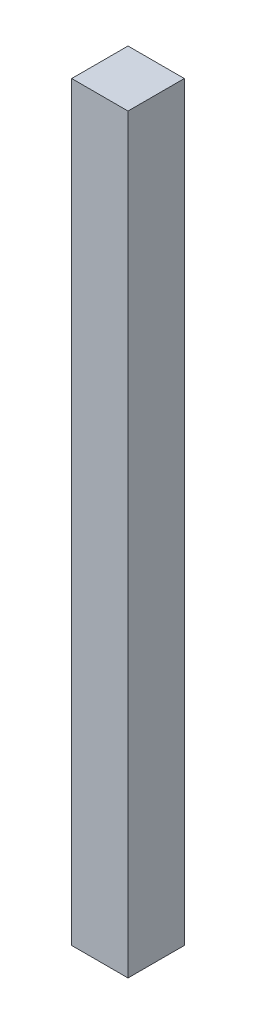
ISO-10303-21;
HEADER;
FILE_DESCRIPTION(('STEP AP214'),'2;1');
FILE_NAME('part.step','',(''),(''),'','','');
FILE_SCHEMA(('AUTOMOTIVE_DESIGN { 1 0 10303 214 1 1 1 1 }'));
ENDSEC;
DATA;
#1=APPLICATION_CONTEXT('core data for automotive mechanical design processes');
#2=APPLICATION_PROTOCOL_DEFINITION('international standard','automotive_design',2000,#1);
#3=PRODUCT_CONTEXT('',#1,'mechanical');
#4=PRODUCT('Part','Part','',(#3));
#5=PRODUCT_RELATED_PRODUCT_CATEGORY('part','',(#4));
#6=PRODUCT_DEFINITION_FORMATION('','',#4);
#7=PRODUCT_DEFINITION_CONTEXT('part definition',#1,'design');
#8=PRODUCT_DEFINITION('design','',#6,#7);
#9=PRODUCT_DEFINITION_SHAPE('','',#8);
#10=(LENGTH_UNIT() NAMED_UNIT(*) SI_UNIT(.MILLI.,.METRE.));
#11=(NAMED_UNIT(*) PLANE_ANGLE_UNIT() SI_UNIT($,.RADIAN.));
#12=(NAMED_UNIT(*) SI_UNIT($,.STERADIAN.) SOLID_ANGLE_UNIT());
#13=UNCERTAINTY_MEASURE_WITH_UNIT(LENGTH_MEASURE(1.E-05),#10,'distance_accuracy_value','');
#14=(GEOMETRIC_REPRESENTATION_CONTEXT(3) GLOBAL_UNCERTAINTY_ASSIGNED_CONTEXT((#13)) GLOBAL_UNIT_ASSIGNED_CONTEXT((#10,
#11,#12)) REPRESENTATION_CONTEXT('',''));
#15=CARTESIAN_POINT('',(0.,0.,0.));
#16=DIRECTION('',(0.,0.,1.));
#17=DIRECTION('',(1.,0.,0.));
#18=AXIS2_PLACEMENT_3D('',#15,#16,#17);
#19=CARTESIAN_POINT('',(4.7625,127.,4.7625));
#20=DIRECTION('',(-1.,0.,0.));
#21=DIRECTION('',(0.,0.,1.));
#22=AXIS2_PLACEMENT_3D('',#19,#20,#21);
#23=PLANE('',#22);
#24=DIRECTION('',(0.,0.,-1.));
#25=VECTOR('',#24,1.);
#26=CARTESIAN_POINT('',(4.7625,0.,4.7625));
#27=LINE('',#26,#25);
#28=CARTESIAN_POINT('',(4.7625,0.,4.7625));
#29=VERTEX_POINT('',#28);
#30=CARTESIAN_POINT('',(4.7625,0.,-4.7625));
#31=VERTEX_POINT('',#30);
#32=EDGE_CURVE('E95',#29,#31,#27,.T.);
#33=ORIENTED_EDGE('',*,*,#32,.T.);
#34=DIRECTION('',(0.,-1.,0.));
#35=VECTOR('',#34,1.);
#36=CARTESIAN_POINT('',(4.7625,127.,-4.7625));
#37=LINE('',#36,#35);
#38=CARTESIAN_POINT('',(4.7625,127.,-4.7625));
#39=VERTEX_POINT('',#38);
#40=EDGE_CURVE('E11',#39,#31,#37,.T.);
#41=ORIENTED_EDGE('',*,*,#40,.F.);
#42=DIRECTION('',(0.,0.,-1.));
#43=VECTOR('',#42,1.);
#44=CARTESIAN_POINT('',(4.7625,127.,4.7625));
#45=LINE('',#44,#43);
#46=CARTESIAN_POINT('',(4.7625,127.,4.7625));
#47=VERTEX_POINT('',#46);
#48=EDGE_CURVE('E83',#47,#39,#45,.T.);
#49=ORIENTED_EDGE('',*,*,#48,.F.);
#50=DIRECTION('',(0.,-1.,0.));
#51=VECTOR('',#50,1.);
#52=CARTESIAN_POINT('',(4.7625,127.,4.7625));
#53=LINE('',#52,#51);
#54=EDGE_CURVE('E91',#47,#29,#53,.T.);
#55=ORIENTED_EDGE('',*,*,#54,.T.);
#56=EDGE_LOOP('',(#33,#41,#49,#55));
#57=FACE_BOUND('',#56,.T.);
#58=ADVANCED_FACE('F32',(#57),#23,.F.);
#59=CARTESIAN_POINT('',(-4.7625,127.,-4.7625));
#60=DIRECTION('',(0.,0.,1.));
#61=DIRECTION('',(1.,0.,0.));
#62=AXIS2_PLACEMENT_3D('',#59,#60,#61);
#63=PLANE('',#62);
#64=DIRECTION('',(-1.,0.,0.));
#65=VECTOR('',#64,1.);
#66=CARTESIAN_POINT('',(-4.7625,0.,-4.7625));
#67=LINE('',#66,#65);
#68=CARTESIAN_POINT('',(-4.7625,0.,-4.7625));
#69=VERTEX_POINT('',#68);
#70=EDGE_CURVE('E87',#31,#69,#67,.T.);
#71=ORIENTED_EDGE('',*,*,#70,.T.);
#72=DIRECTION('',(0.,-1.,0.));
#73=VECTOR('',#72,1.);
#74=CARTESIAN_POINT('',(-4.7625,127.,-4.7625));
#75=LINE('',#74,#73);
#76=CARTESIAN_POINT('',(-4.7625,127.,-4.7625));
#77=VERTEX_POINT('',#76);
#78=EDGE_CURVE('E40',#77,#69,#75,.T.);
#79=ORIENTED_EDGE('',*,*,#78,.F.);
#80=DIRECTION('',(-1.,0.,0.));
#81=VECTOR('',#80,1.);
#82=CARTESIAN_POINT('',(-4.7625,127.,-4.7625));
#83=LINE('',#82,#81);
#84=EDGE_CURVE('E78',#39,#77,#83,.T.);
#85=ORIENTED_EDGE('',*,*,#84,.F.);
#86=ORIENTED_EDGE('',*,*,#40,.T.);
#87=EDGE_LOOP('',(#71,#79,#85,#86));
#88=FACE_BOUND('',#87,.T.);
#89=ADVANCED_FACE('F86',(#88),#63,.F.);
#90=CARTESIAN_POINT('',(-4.7625,127.,4.7625));
#91=DIRECTION('',(1.,0.,0.));
#92=DIRECTION('',(0.,0.,-1.));
#93=AXIS2_PLACEMENT_3D('',#90,#91,#92);
#94=PLANE('',#93);
#95=DIRECTION('',(0.,0.,1.));
#96=VECTOR('',#95,1.);
#97=CARTESIAN_POINT('',(-4.7625,0.,4.7625));
#98=LINE('',#97,#96);
#99=CARTESIAN_POINT('',(-4.7625,0.,4.7625));
#100=VERTEX_POINT('',#99);
#101=EDGE_CURVE('E65',#69,#100,#98,.T.);
#102=ORIENTED_EDGE('',*,*,#101,.T.);
#103=DIRECTION('',(0.,-1.,0.));
#104=VECTOR('',#103,1.);
#105=CARTESIAN_POINT('',(-4.7625,127.,4.7625));
#106=LINE('',#105,#104);
#107=CARTESIAN_POINT('',(-4.7625,127.,4.7625));
#108=VERTEX_POINT('',#107);
#109=EDGE_CURVE('E88',#108,#100,#106,.T.);
#110=ORIENTED_EDGE('',*,*,#109,.F.);
#111=DIRECTION('',(0.,0.,1.));
#112=VECTOR('',#111,1.);
#113=CARTESIAN_POINT('',(-4.7625,127.,4.7625));
#114=LINE('',#113,#112);
#115=EDGE_CURVE('E81',#77,#108,#114,.T.);
#116=ORIENTED_EDGE('',*,*,#115,.F.);
#117=ORIENTED_EDGE('',*,*,#78,.T.);
#118=EDGE_LOOP('',(#102,#110,#116,#117));
#119=FACE_BOUND('',#118,.T.);
#120=ADVANCED_FACE('F89',(#119),#94,.F.);
#121=CARTESIAN_POINT('',(-4.7625,127.,4.7625));
#122=DIRECTION('',(0.,0.,-1.));
#123=DIRECTION('',(-1.,0.,0.));
#124=AXIS2_PLACEMENT_3D('',#121,#122,#123);
#125=PLANE('',#124);
#126=DIRECTION('',(1.,0.,0.));
#127=VECTOR('',#126,1.);
#128=CARTESIAN_POINT('',(-4.7625,0.,4.7625));
#129=LINE('',#128,#127);
#130=EDGE_CURVE('E71',#100,#29,#129,.T.);
#131=ORIENTED_EDGE('',*,*,#130,.T.);
#132=ORIENTED_EDGE('',*,*,#54,.F.);
#133=DIRECTION('',(1.,0.,0.));
#134=VECTOR('',#133,1.);
#135=CARTESIAN_POINT('',(-4.7625,127.,4.7625));
#136=LINE('',#135,#134);
#137=EDGE_CURVE('E48',#108,#47,#136,.T.);
#138=ORIENTED_EDGE('',*,*,#137,.F.);
#139=ORIENTED_EDGE('',*,*,#109,.T.);
#140=EDGE_LOOP('',(#131,#132,#138,#139));
#141=FACE_BOUND('',#140,.T.);
#142=ADVANCED_FACE('F102',(#141),#125,.F.);
#143=CARTESIAN_POINT('',(0.,127.,0.));
#144=DIRECTION('',(0.,-1.,0.));
#145=DIRECTION('',(0.,0.,-1.));
#146=AXIS2_PLACEMENT_3D('',#143,#144,#145);
#147=PLANE('',#146);
#148=ORIENTED_EDGE('',*,*,#48,.T.);
#149=ORIENTED_EDGE('',*,*,#84,.T.);
#150=ORIENTED_EDGE('',*,*,#115,.T.);
#151=ORIENTED_EDGE('',*,*,#137,.T.);
#152=EDGE_LOOP('',(#148,#149,#150,#151));
#153=FACE_BOUND('',#152,.T.);
#154=ADVANCED_FACE('F79',(#153),#147,.F.);
#155=CARTESIAN_POINT('',(0.,0.,0.));
#156=DIRECTION('',(0.,-1.,0.));
#157=DIRECTION('',(0.,0.,-1.));
#158=AXIS2_PLACEMENT_3D('',#155,#156,#157);
#159=PLANE('',#158);
#160=ORIENTED_EDGE('',*,*,#32,.F.);
#161=ORIENTED_EDGE('',*,*,#130,.F.);
#162=ORIENTED_EDGE('',*,*,#101,.F.);
#163=ORIENTED_EDGE('',*,*,#70,.F.);
#164=EDGE_LOOP('',(#160,#161,#162,#163));
#165=FACE_BOUND('',#164,.T.);
#166=ADVANCED_FACE('F105',(#165),#159,.T.);
#167=CLOSED_SHELL('',(#58,#89,#120,#142,#154,#166));
#168=MANIFOLD_SOLID_BREP('B2',#167);
#169=ADVANCED_BREP_SHAPE_REPRESENTATION('',(#18,#168),#14);
#170=SHAPE_DEFINITION_REPRESENTATION(#9,#169);
ENDSEC;
END-ISO-10303-21;
